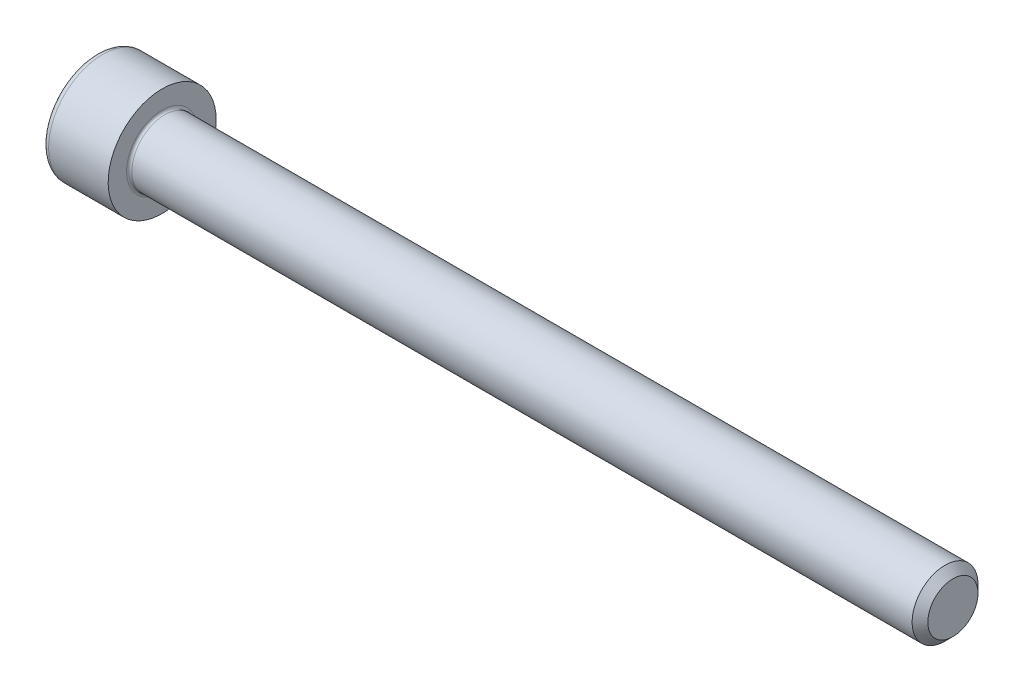
ISO-10303-21;
HEADER;
FILE_DESCRIPTION(('STEP AP214'),'2;1');
FILE_NAME('part.step','',(''),(''),'','','');
FILE_SCHEMA(('AUTOMOTIVE_DESIGN { 1 0 10303 214 1 1 1 1 }'));
ENDSEC;
DATA;
#1=APPLICATION_CONTEXT('core data for automotive mechanical design processes');
#2=APPLICATION_PROTOCOL_DEFINITION('international standard','automotive_design',2000,#1);
#3=PRODUCT_CONTEXT('',#1,'mechanical');
#4=PRODUCT('Part','Part','',(#3));
#5=PRODUCT_RELATED_PRODUCT_CATEGORY('part','',(#4));
#6=PRODUCT_DEFINITION_FORMATION('','',#4);
#7=PRODUCT_DEFINITION_CONTEXT('part definition',#1,'design');
#8=PRODUCT_DEFINITION('design','',#6,#7);
#9=PRODUCT_DEFINITION_SHAPE('','',#8);
#10=(LENGTH_UNIT() NAMED_UNIT(*) SI_UNIT(.MILLI.,.METRE.));
#11=(NAMED_UNIT(*) PLANE_ANGLE_UNIT() SI_UNIT($,.RADIAN.));
#12=(NAMED_UNIT(*) SI_UNIT($,.STERADIAN.) SOLID_ANGLE_UNIT());
#13=UNCERTAINTY_MEASURE_WITH_UNIT(LENGTH_MEASURE(1.E-05),#10,'distance_accuracy_value','');
#14=(GEOMETRIC_REPRESENTATION_CONTEXT(3) GLOBAL_UNCERTAINTY_ASSIGNED_CONTEXT((#13)) GLOBAL_UNIT_ASSIGNED_CONTEXT((#10,
#11,#12)) REPRESENTATION_CONTEXT('',''));
#15=CARTESIAN_POINT('',(0.,0.,0.));
#16=DIRECTION('',(0.,0.,1.));
#17=DIRECTION('',(1.,0.,0.));
#18=AXIS2_PLACEMENT_3D('',#15,#16,#17);
#19=CARTESIAN_POINT('',(-1.73197520001622,0.,0.));
#20=DIRECTION('',(-1.,0.,0.));
#21=DIRECTION('',(0.,0.,1.));
#22=AXIS2_PLACEMENT_3D('',#19,#20,#21);
#23=CONICAL_SURFACE('',#22,1.38675239173836,1.04719755120409);
#24=CARTESIAN_POINT('',(-0.93133333342621,1.13686837721616E-10,0.));
#25=VERTEX_POINT('',#24);
#26=VERTEX_LOOP('',#25);
#27=FACE_BOUND('',#26,.T.);
#28=CARTESIAN_POINT('',(-1.72720000001244,1.1938,0.689240751354982));
#29=CARTESIAN_POINT('',(-1.70970817089895,1.1938,0.628664837695865));
#30=CARTESIAN_POINT('',(-1.69380026777436,1.1938,0.567566033611831));
#31=CARTESIAN_POINT('',(-1.66603350065317,1.1938,0.444310540521224));
#32=CARTESIAN_POINT('',(-1.65418445841408,1.1938,0.382151662215969));
#33=CARTESIAN_POINT('',(-1.6357405699097,1.1938,0.258604209424688));
#34=CARTESIAN_POINT('',(-1.62902295503157,1.1938,0.197234638972875));
#35=CARTESIAN_POINT('',(-1.62100502447231,1.1938,0.074206884617875));
#36=CARTESIAN_POINT('',(-1.61969806765852,1.1938,0.0125491475802938));
#37=CARTESIAN_POINT('',(-1.62242392860873,1.1938,-0.102651719591601));
#38=CARTESIAN_POINT('',(-1.62578745716085,1.1938,-0.15621213655455));
#39=CARTESIAN_POINT('',(-1.63644571281367,1.1938,-0.262984041835023));
#40=CARTESIAN_POINT('',(-1.64374407719022,1.1938,-0.316195161132675));
#41=CARTESIAN_POINT('',(-1.66198857553395,1.1938,-0.423187026607383));
#42=CARTESIAN_POINT('',(-1.67301201065409,1.1938,-0.476954238351073));
#43=CARTESIAN_POINT('',(-1.69803054805828,1.1938,-0.583686955815079));
#44=CARTESIAN_POINT('',(-1.71201977575506,1.1938,-0.636653827850075));
#45=CARTESIAN_POINT('',(-1.72720000001244,1.1938,-0.689240751354984));
#46=B_SPLINE_CURVE_WITH_KNOTS('',3,(#28,#29,#30,#31,#32,#33,#34,#35,#36,#37,#38,#39,#40,#41,#42,
#43,#44,#45),.UNSPECIFIED.,.F.,.F.,(4,2,2,2,2,2,2,2,4),(0.,0.189226857297496,0.378908429381874,
0.563895970110463,0.748656386580298,0.90950117544892,1.07049490127057,1.23505869645672,
1.39929952238289),.UNSPECIFIED.);
#47=CARTESIAN_POINT('',(-1.72720000001244,1.19379999999845,0.689240751357676));
#48=VERTEX_POINT('',#47);
#49=CARTESIAN_POINT('',(-1.72720000001296,1.1938,-0.689240751356779));
#50=VERTEX_POINT('',#49);
#51=EDGE_CURVE('E21',#48,#50,#46,.T.);
#52=ORIENTED_EDGE('',*,*,#51,.T.);
#53=CARTESIAN_POINT('',(-1.72720000001244,1.19379999999689,-0.689240751360371));
#54=CARTESIAN_POINT('',(-1.70970817089895,1.14133971991064,-0.719528708189929));
#55=CARTESIAN_POINT('',(-1.69380026777436,1.08842660343302,-0.750078110231946));
#56=CARTESIAN_POINT('',(-1.66603350065317,0.981684215260574,-0.811705856777249));
#57=CARTESIAN_POINT('',(-1.65418445841408,0.927853047577479,-0.842785295929877));
#58=CARTESIAN_POINT('',(-1.6357405699097,0.820857814887371,-0.904559022325517));
#59=CARTESIAN_POINT('',(-1.62902295503157,0.767710207856762,-0.935243807551424));
#60=CARTESIAN_POINT('',(-1.62100502447231,0.66116504721478,-0.996757684728924));
#61=CARTESIAN_POINT('',(-1.61969806765852,0.607767880600374,-1.02758655324771));
#62=CARTESIAN_POINT('',(-1.62242392860872,0.508001003091517,-1.08518698683366));
#63=CARTESIAN_POINT('',(-1.62578745716085,0.461616321364316,-1.11196719531514));
#64=CARTESIAN_POINT('',(-1.63644571281367,0.36914913898096,-1.16535314795537));
#65=CARTESIAN_POINT('',(-1.64374407719022,0.323066957905389,-1.1919587076042));
#66=CARTESIAN_POINT('',(-1.66198857553395,0.230409284406005,-1.24545464034155));
#67=CARTESIAN_POINT('',(-1.67301201065409,0.183845513145312,-1.2723382462134));
#68=CARTESIAN_POINT('',(-1.69803054805828,0.0914122684065358,-1.3257046049454));
#69=CARTESIAN_POINT('',(-1.71201977575506,0.0455416116652293,-1.3521880409629));
#70=CARTESIAN_POINT('',(-1.72720000001244,3.1093190957536E-12,-1.37848150271535));
#71=B_SPLINE_CURVE_WITH_KNOTS('',3,(#53,#54,#55,#56,#57,#58,#59,#60,#61,#62,#63,#64,#65,#66,#67,
#68,#69,#70),.UNSPECIFIED.,.F.,.F.,(4,2,2,2,2,2,2,2,4),(0.,0.189226857297496,0.378908429381874,
0.563895970110463,0.748656386580297,0.90950117544892,1.07049490127057,1.23505869645672,
1.39929952238289),.UNSPECIFIED.);
#72=CARTESIAN_POINT('',(-1.72720000001244,0.,-1.37848150271535));
#73=VERTEX_POINT('',#72);
#74=EDGE_CURVE('E81',#50,#73,#71,.T.);
#75=ORIENTED_EDGE('',*,*,#74,.T.);
#76=CARTESIAN_POINT('',(-1.72720000001244,-3.11102390153181E-12,-1.37848150271535));
#77=CARTESIAN_POINT('',(-1.70970817089895,-0.0524602800893588,-1.3481935458858));
#78=CARTESIAN_POINT('',(-1.69380026777436,-0.105373396566981,-1.31764414384378));
#79=CARTESIAN_POINT('',(-1.66603350065317,-0.212115784739424,-1.25601639729847));
#80=CARTESIAN_POINT('',(-1.65418445841408,-0.26594695242252,-1.22493695814585));
#81=CARTESIAN_POINT('',(-1.6357405699097,-0.372942185112628,-1.16316323175021));
#82=CARTESIAN_POINT('',(-1.62902295503157,-0.426089792143237,-1.1324784465243));
#83=CARTESIAN_POINT('',(-1.62100502447231,-0.532634952785219,-1.0709645693468));
#84=CARTESIAN_POINT('',(-1.61969806765852,-0.586032119399625,-1.04013570082801));
#85=CARTESIAN_POINT('',(-1.62242392860873,-0.685798996908482,-0.982535267242062));
#86=CARTESIAN_POINT('',(-1.62578745716085,-0.732183678635683,-0.955755058760588));
#87=CARTESIAN_POINT('',(-1.63644571281367,-0.824650861019039,-0.902369106120351));
#88=CARTESIAN_POINT('',(-1.64374407719022,-0.87073304209461,-0.875763546471525));
#89=CARTESIAN_POINT('',(-1.66198857553395,-0.963390715593994,-0.822267613734171));
#90=CARTESIAN_POINT('',(-1.67301201065409,-1.00995448685469,-0.795384007862326));
#91=CARTESIAN_POINT('',(-1.69803054805828,-1.10238773159346,-0.742017649130323));
#92=CARTESIAN_POINT('',(-1.71201977575506,-1.14825838833477,-0.715534213112825));
#93=CARTESIAN_POINT('',(-1.72720000001244,-1.19379999999689,-0.68924075136037));
#94=B_SPLINE_CURVE_WITH_KNOTS('',3,(#76,#77,#78,#79,#80,#81,#82,#83,#84,#85,#86,#87,#88,#89,#90,
#91,#92,#93),.UNSPECIFIED.,.F.,.F.,(4,2,2,2,2,2,2,2,4),(0.,0.189226857297497,0.378908429381874,
0.563895970110463,0.748656386580298,0.90950117544892,1.07049490127057,1.23505869645672,
1.39929952238289),.UNSPECIFIED.);
#95=CARTESIAN_POINT('',(-1.72720000001244,-1.19379999999844,-0.689240751357677));
#96=VERTEX_POINT('',#95);
#97=EDGE_CURVE('E106',#73,#96,#94,.T.);
#98=ORIENTED_EDGE('',*,*,#97,.T.);
#99=CARTESIAN_POINT('',(-1.72720000001244,-1.1938,-0.689240751354983));
#100=CARTESIAN_POINT('',(-1.70970817089895,-1.1938,-0.628664837695867));
#101=CARTESIAN_POINT('',(-1.69380026777436,-1.1938,-0.567566033611832));
#102=CARTESIAN_POINT('',(-1.66603350065317,-1.1938,-0.444310540521225));
#103=CARTESIAN_POINT('',(-1.65418445841408,-1.1938,-0.38215166221597));
#104=CARTESIAN_POINT('',(-1.6357405699097,-1.1938,-0.258604209424689));
#105=CARTESIAN_POINT('',(-1.62902295503157,-1.1938,-0.197234638972876));
#106=CARTESIAN_POINT('',(-1.62100502447231,-1.1938,-0.074206884617876));
#107=CARTESIAN_POINT('',(-1.61969806765852,-1.1938,-0.0125491475802948));
#108=CARTESIAN_POINT('',(-1.62242392860873,-1.1938,0.1026517195916));
#109=CARTESIAN_POINT('',(-1.62578745716085,-1.1938,0.156212136554549));
#110=CARTESIAN_POINT('',(-1.63644571281367,-1.1938,0.262984041835022));
#111=CARTESIAN_POINT('',(-1.64374407719022,-1.1938,0.316195161132674));
#112=CARTESIAN_POINT('',(-1.66198857553395,-1.1938,0.423187026607382));
#113=CARTESIAN_POINT('',(-1.67301201065409,-1.1938,0.476954238351073));
#114=CARTESIAN_POINT('',(-1.69803054805828,-1.1938,0.583686955815078));
#115=CARTESIAN_POINT('',(-1.71201977575506,-1.1938,0.636653827850075));
#116=CARTESIAN_POINT('',(-1.72720000001244,-1.1938,0.689240751354983));
#117=B_SPLINE_CURVE_WITH_KNOTS('',3,(#99,#100,#101,#102,#103,#104,#105,#106,#107,#108,#109,#110,
#111,#112,#113,#114,#115,#116),.UNSPECIFIED.,.F.,.F.,(4,2,2,2,2,2,2,2,4),(0.,0.189226857297497,
0.378908429381875,0.563895970110464,0.748656386580298,0.909501175448921,1.07049490127057,
1.23505869645672,1.39929952238289),.UNSPECIFIED.);
#118=CARTESIAN_POINT('',(-1.72720000001244,-1.19379999999844,0.689240751357677));
#119=VERTEX_POINT('',#118);
#120=EDGE_CURVE('E130',#96,#119,#117,.T.);
#121=ORIENTED_EDGE('',*,*,#120,.T.);
#122=CARTESIAN_POINT('',(-1.72720000001244,-1.19379999999689,0.68924075136037));
#123=CARTESIAN_POINT('',(-1.70970817089895,-1.14133971991064,0.719528708189929));
#124=CARTESIAN_POINT('',(-1.69380026777436,-1.08842660343302,0.750078110231946));
#125=CARTESIAN_POINT('',(-1.66603350065317,-0.981684215260577,0.81170585677725));
#126=CARTESIAN_POINT('',(-1.65418445841408,-0.927853047577481,0.842785295929877));
#127=CARTESIAN_POINT('',(-1.6357405699097,-0.820857814887373,0.904559022325517));
#128=CARTESIAN_POINT('',(-1.62902295503157,-0.767710207856764,0.935243807551424));
#129=CARTESIAN_POINT('',(-1.62100502447231,-0.661165047214782,0.996757684728924));
#130=CARTESIAN_POINT('',(-1.61969806765852,-0.607767880600376,1.02758655324771));
#131=CARTESIAN_POINT('',(-1.62242392860873,-0.508001003091518,1.08518698683366));
#132=CARTESIAN_POINT('',(-1.62578745716085,-0.461616321364317,1.11196719531514));
#133=CARTESIAN_POINT('',(-1.63644571281367,-0.369149138980961,1.16535314795537));
#134=CARTESIAN_POINT('',(-1.64374407719022,-0.32306695790539,1.1919587076042));
#135=CARTESIAN_POINT('',(-1.66198857553395,-0.230409284406006,1.24545464034155));
#136=CARTESIAN_POINT('',(-1.67301201065409,-0.183845513145313,1.2723382462134));
#137=CARTESIAN_POINT('',(-1.69803054805828,-0.0914122684065366,1.3257046049454));
#138=CARTESIAN_POINT('',(-1.71201977575506,-0.0455416116652301,1.3521880409629));
#139=CARTESIAN_POINT('',(-1.72720000001244,-3.11015438542773E-12,1.37848150271535));
#140=B_SPLINE_CURVE_WITH_KNOTS('',3,(#122,#123,#124,#125,#126,#127,#128,#129,#130,#131,#132,
#133,#134,#135,#136,#137,#138,#139),.UNSPECIFIED.,.F.,.F.,(4,2,2,2,2,2,2,2,4),(0.,
0.189226857297497,0.378908429381875,0.563895970110464,0.748656386580298,0.909501175448921,
1.07049490127057,1.23505869645672,1.3992995223829),.UNSPECIFIED.);
#141=CARTESIAN_POINT('',(-1.72720000001244,0.,1.37848150271535));
#142=VERTEX_POINT('',#141);
#143=EDGE_CURVE('E138',#119,#142,#140,.T.);
#144=ORIENTED_EDGE('',*,*,#143,.T.);
#145=CARTESIAN_POINT('',(-1.72720000001244,3.11022577188329E-12,1.37848150271535));
#146=CARTESIAN_POINT('',(-1.70970817089895,0.052460280089358,1.3481935458858));
#147=CARTESIAN_POINT('',(-1.69380026777436,0.105373396566981,1.31764414384378));
#148=CARTESIAN_POINT('',(-1.66603350065317,0.212115784739423,1.25601639729848));
#149=CARTESIAN_POINT('',(-1.65418445841408,0.265946952422519,1.22493695814585));
#150=CARTESIAN_POINT('',(-1.6357405699097,0.372942185112627,1.16316323175021));
#151=CARTESIAN_POINT('',(-1.62902295503157,0.426089792143236,1.1324784465243));
#152=CARTESIAN_POINT('',(-1.62100502447231,0.532634952785218,1.0709645693468));
#153=CARTESIAN_POINT('',(-1.61969806765852,0.586032119399624,1.04013570082801));
#154=CARTESIAN_POINT('',(-1.62242392860873,0.685798996908482,0.982535267242062));
#155=CARTESIAN_POINT('',(-1.62578745716085,0.732183678635683,0.955755058760588));
#156=CARTESIAN_POINT('',(-1.63644571281367,0.824650861019039,0.902369106120351));
#157=CARTESIAN_POINT('',(-1.64374407719022,0.870733042094609,0.875763546471525));
#158=CARTESIAN_POINT('',(-1.66198857553395,0.963390715593994,0.822267613734171));
#159=CARTESIAN_POINT('',(-1.67301201065409,1.00995448685469,0.795384007862325));
#160=CARTESIAN_POINT('',(-1.69803054805828,1.10238773159346,0.742017649130322));
#161=CARTESIAN_POINT('',(-1.71201977575506,1.14825838833477,0.715534213112824));
#162=CARTESIAN_POINT('',(-1.72720000001244,1.19379999999689,0.68924075136037));
#163=B_SPLINE_CURVE_WITH_KNOTS('',3,(#145,#146,#147,#148,#149,#150,#151,#152,#153,#154,#155,
#156,#157,#158,#159,#160,#161,#162),.UNSPECIFIED.,.F.,.F.,(4,2,2,2,2,2,2,2,4),(0.,
0.189226857297497,0.378908429381875,0.563895970110464,0.748656386580298,0.909501175448921,
1.07049490127057,1.23505869645673,1.3992995223829),.UNSPECIFIED.);
#164=EDGE_CURVE('E83',#142,#48,#163,.T.);
#165=ORIENTED_EDGE('',*,*,#164,.T.);
#166=EDGE_LOOP('',(#52,#75,#98,#121,#144,#165));
#167=FACE_BOUND('',#166,.T.);
#168=ADVANCED_FACE('F17',(#27,#167),#23,.F.);
#169=CARTESIAN_POINT('',(-3.175,1.1938,0.689240751358572));
#170=DIRECTION('',(0.,1.,0.));
#171=DIRECTION('',(0.,0.,1.));
#172=AXIS2_PLACEMENT_3D('',#169,#170,#171);
#173=PLANE('',#172);
#174=DIRECTION('',(1.,0.,0.));
#175=VECTOR('',#174,1.);
#176=CARTESIAN_POINT('',(-3.175,1.1938,0.689240751358574));
#177=LINE('',#176,#175);
#178=CARTESIAN_POINT('',(-3.175,1.1938,0.689240751358573));
#179=VERTEX_POINT('',#178);
#180=EDGE_CURVE('E85',#48,#179,#177,.F.);
#181=ORIENTED_EDGE('',*,*,#180,.T.);
#182=DIRECTION('',(0.,0.,1.));
#183=VECTOR('',#182,1.);
#184=CARTESIAN_POINT('',(-3.175,1.1938,0.));
#185=LINE('',#184,#183);
#186=CARTESIAN_POINT('',(-3.175,1.1938,-0.689240751358575));
#187=VERTEX_POINT('',#186);
#188=EDGE_CURVE('E90',#187,#179,#185,.T.);
#189=ORIENTED_EDGE('',*,*,#188,.F.);
#190=DIRECTION('',(1.,0.,0.));
#191=VECTOR('',#190,1.);
#192=CARTESIAN_POINT('',(-3.175,1.1938,-0.689240751358575));
#193=LINE('',#192,#191);
#194=EDGE_CURVE('E88',#187,#50,#193,.T.);
#195=ORIENTED_EDGE('',*,*,#194,.T.);
#196=ORIENTED_EDGE('',*,*,#51,.F.);
#197=EDGE_LOOP('',(#181,#189,#195,#196));
#198=FACE_BOUND('',#197,.T.);
#199=ADVANCED_FACE('F77',(#198),#173,.F.);
#200=CARTESIAN_POINT('',(-3.175,0.,1.37848150271715));
#201=DIRECTION('',(0.,0.5,0.866025403784438));
#202=DIRECTION('',(0.,-0.866025403784438,0.5));
#203=AXIS2_PLACEMENT_3D('',#200,#201,#202);
#204=PLANE('',#203);
#205=DIRECTION('',(1.,0.,0.));
#206=VECTOR('',#205,1.);
#207=CARTESIAN_POINT('',(-3.175,0.,1.37848150271715));
#208=LINE('',#207,#206);
#209=CARTESIAN_POINT('',(-3.175,0.,1.37848150271715));
#210=VERTEX_POINT('',#209);
#211=EDGE_CURVE('E142',#142,#210,#208,.F.);
#212=ORIENTED_EDGE('',*,*,#211,.T.);
#213=DIRECTION('',(0.,-0.866025403784438,0.500000000000001));
#214=VECTOR('',#213,1.);
#215=CARTESIAN_POINT('',(-3.175,1.1938,0.689240751358572));
#216=LINE('',#215,#214);
#217=EDGE_CURVE('E96',#179,#210,#216,.T.);
#218=ORIENTED_EDGE('',*,*,#217,.F.);
#219=ORIENTED_EDGE('',*,*,#180,.F.);
#220=ORIENTED_EDGE('',*,*,#164,.F.);
#221=EDGE_LOOP('',(#212,#218,#219,#220));
#222=FACE_BOUND('',#221,.T.);
#223=ADVANCED_FACE('F146',(#222),#204,.F.);
#224=CARTESIAN_POINT('',(-3.175,-1.1938,0.689240751358575));
#225=DIRECTION('',(0.,-0.5,0.866025403784439));
#226=DIRECTION('',(0.,-0.866025403784439,-0.5));
#227=AXIS2_PLACEMENT_3D('',#224,#225,#226);
#228=PLANE('',#227);
#229=DIRECTION('',(1.,0.,0.));
#230=VECTOR('',#229,1.);
#231=CARTESIAN_POINT('',(-3.175,-1.1938,0.689240751358575));
#232=LINE('',#231,#230);
#233=CARTESIAN_POINT('',(-3.175,-1.1938,0.689240751358575));
#234=VERTEX_POINT('',#233);
#235=EDGE_CURVE('E137',#119,#234,#232,.F.);
#236=ORIENTED_EDGE('',*,*,#235,.T.);
#237=DIRECTION('',(0.,-0.866025403784439,-0.5));
#238=VECTOR('',#237,1.);
#239=CARTESIAN_POINT('',(-3.175,0.,1.37848150271715));
#240=LINE('',#239,#238);
#241=EDGE_CURVE('E265',#210,#234,#240,.T.);
#242=ORIENTED_EDGE('',*,*,#241,.F.);
#243=ORIENTED_EDGE('',*,*,#211,.F.);
#244=ORIENTED_EDGE('',*,*,#143,.F.);
#245=EDGE_LOOP('',(#236,#242,#243,#244));
#246=FACE_BOUND('',#245,.T.);
#247=ADVANCED_FACE('F126',(#246),#228,.F.);
#248=CARTESIAN_POINT('',(-3.175,-1.1938,-0.689240751358575));
#249=DIRECTION('',(0.,-1.,0.));
#250=DIRECTION('',(1.,0.,0.));
#251=AXIS2_PLACEMENT_3D('',#248,#249,#250);
#252=PLANE('',#251);
#253=DIRECTION('',(1.,0.,0.));
#254=VECTOR('',#253,1.);
#255=CARTESIAN_POINT('',(-3.175,-1.1938,-0.689240751358575));
#256=LINE('',#255,#254);
#257=CARTESIAN_POINT('',(-3.175,-1.1938,-0.689240751358575));
#258=VERTEX_POINT('',#257);
#259=EDGE_CURVE('E136',#96,#258,#256,.F.);
#260=ORIENTED_EDGE('',*,*,#259,.T.);
#261=DIRECTION('',(0.,0.,1.));
#262=VECTOR('',#261,1.);
#263=CARTESIAN_POINT('',(-3.175,-1.1938,0.));
#264=LINE('',#263,#262);
#265=EDGE_CURVE('E260',#234,#258,#264,.F.);
#266=ORIENTED_EDGE('',*,*,#265,.F.);
#267=ORIENTED_EDGE('',*,*,#235,.F.);
#268=ORIENTED_EDGE('',*,*,#120,.F.);
#269=EDGE_LOOP('',(#260,#266,#267,#268));
#270=FACE_BOUND('',#269,.T.);
#271=ADVANCED_FACE('F122',(#270),#252,.F.);
#272=CARTESIAN_POINT('',(-3.175,0.,-1.37848150271715));
#273=DIRECTION('',(0.,-0.5,-0.866025403784438));
#274=DIRECTION('',(0.,0.866025403784438,-0.5));
#275=AXIS2_PLACEMENT_3D('',#272,#273,#274);
#276=PLANE('',#275);
#277=DIRECTION('',(1.,0.,0.));
#278=VECTOR('',#277,1.);
#279=CARTESIAN_POINT('',(-3.175,0.,-1.37848150271715));
#280=LINE('',#279,#278);
#281=CARTESIAN_POINT('',(-3.175,0.,-1.37848150271715));
#282=VERTEX_POINT('',#281);
#283=EDGE_CURVE('E39',#73,#282,#280,.F.);
#284=ORIENTED_EDGE('',*,*,#283,.T.);
#285=DIRECTION('',(0.,0.866025403784439,-0.5));
#286=VECTOR('',#285,1.);
#287=CARTESIAN_POINT('',(-3.175,-1.1938,-0.689240751358575));
#288=LINE('',#287,#286);
#289=EDGE_CURVE('E255',#258,#282,#288,.T.);
#290=ORIENTED_EDGE('',*,*,#289,.F.);
#291=ORIENTED_EDGE('',*,*,#259,.F.);
#292=ORIENTED_EDGE('',*,*,#97,.F.);
#293=EDGE_LOOP('',(#284,#290,#291,#292));
#294=FACE_BOUND('',#293,.T.);
#295=ADVANCED_FACE('F116',(#294),#276,.F.);
#296=CARTESIAN_POINT('',(-3.175,1.1938,-0.689240751358575));
#297=DIRECTION('',(0.,0.5,-0.866025403784439));
#298=DIRECTION('',(0.,0.866025403784439,0.5));
#299=AXIS2_PLACEMENT_3D('',#296,#297,#298);
#300=PLANE('',#299);
#301=ORIENTED_EDGE('',*,*,#194,.F.);
#302=DIRECTION('',(0.,0.866025403784438,0.500000000000001));
#303=VECTOR('',#302,1.);
#304=CARTESIAN_POINT('',(-3.175,0.,-1.37848150271715));
#305=LINE('',#304,#303);
#306=EDGE_CURVE('E253',#282,#187,#305,.T.);
#307=ORIENTED_EDGE('',*,*,#306,.F.);
#308=ORIENTED_EDGE('',*,*,#283,.F.);
#309=ORIENTED_EDGE('',*,*,#74,.F.);
#310=EDGE_LOOP('',(#301,#307,#308,#309));
#311=FACE_BOUND('',#310,.T.);
#312=ADVANCED_FACE('F94',(#311),#300,.F.);
#313=CARTESIAN_POINT('',(-3.175,1.99099075135857,0.));
#314=DIRECTION('',(-1.,0.,0.));
#315=DIRECTION('',(0.,-1.,0.));
#316=AXIS2_PLACEMENT_3D('',#313,#314,#315);
#317=PLANE('',#316);
#318=ORIENTED_EDGE('',*,*,#289,.T.);
#319=ORIENTED_EDGE('',*,*,#306,.T.);
#320=ORIENTED_EDGE('',*,*,#188,.T.);
#321=ORIENTED_EDGE('',*,*,#217,.T.);
#322=ORIENTED_EDGE('',*,*,#241,.T.);
#323=ORIENTED_EDGE('',*,*,#265,.T.);
#324=EDGE_LOOP('',(#318,#319,#320,#321,#322,#323));
#325=FACE_BOUND('',#324,.T.);
#326=CARTESIAN_POINT('',(-3.175,0.,0.));
#327=DIRECTION('',(1.,0.,0.));
#328=DIRECTION('',(0.,1.,0.));
#329=AXIS2_PLACEMENT_3D('',#326,#327,#328);
#330=CIRCLE('',#329,2.2987);
#331=CARTESIAN_POINT('',(-3.175,2.2987,0.));
#332=VERTEX_POINT('',#331);
#333=EDGE_CURVE('E216',#332,#332,#330,.T.);
#334=ORIENTED_EDGE('',*,*,#333,.F.);
#335=EDGE_LOOP('',(#334));
#336=FACE_BOUND('',#335,.T.);
#337=ADVANCED_FACE('F115',(#325,#336),#317,.T.);
#338=CARTESIAN_POINT('',(-2.8702,0.,0.));
#339=DIRECTION('',(1.,0.,0.));
#340=DIRECTION('',(0.,0.,-1.));
#341=AXIS2_PLACEMENT_3D('',#338,#339,#340);
#342=TOROIDAL_SURFACE('',#341,2.2987,0.3048);
#343=CARTESIAN_POINT('',(-2.8702,0.,0.));
#344=DIRECTION('',(1.,0.,0.));
#345=DIRECTION('',(0.,1.,0.));
#346=AXIS2_PLACEMENT_3D('',#343,#344,#345);
#347=CIRCLE('',#346,2.6035);
#348=CARTESIAN_POINT('',(-2.8702,2.6035,0.));
#349=VERTEX_POINT('',#348);
#350=EDGE_CURVE('E280',#349,#349,#347,.T.);
#351=ORIENTED_EDGE('',*,*,#350,.F.);
#352=EDGE_LOOP('',(#351));
#353=FACE_BOUND('',#352,.T.);
#354=ORIENTED_EDGE('',*,*,#333,.T.);
#355=EDGE_LOOP('',(#354));
#356=FACE_BOUND('',#355,.T.);
#357=ADVANCED_FACE('F200',(#353,#356),#342,.T.);
#358=CARTESIAN_POINT('',(-1.58749999999999,0.,0.));
#359=DIRECTION('',(1.,0.,0.));
#360=DIRECTION('',(0.,1.,0.));
#361=AXIS2_PLACEMENT_3D('',#358,#359,#360);
#362=CYLINDRICAL_SURFACE('',#361,2.6035);
#363=ORIENTED_EDGE('',*,*,#350,.T.);
#364=EDGE_LOOP('',(#363));
#365=FACE_BOUND('',#364,.T.);
#366=CARTESIAN_POINT('',(0.,0.,0.));
#367=DIRECTION('',(1.,0.,0.));
#368=DIRECTION('',(0.,1.,0.));
#369=AXIS2_PLACEMENT_3D('',#366,#367,#368);
#370=CIRCLE('',#369,2.6035);
#371=CARTESIAN_POINT('',(0.,2.6035,0.));
#372=VERTEX_POINT('',#371);
#373=EDGE_CURVE('E104',#372,#372,#370,.T.);
#374=ORIENTED_EDGE('',*,*,#373,.F.);
#375=EDGE_LOOP('',(#374));
#376=FACE_BOUND('',#375,.T.);
#377=ADVANCED_FACE('F197',(#365,#376),#362,.T.);
#378=CARTESIAN_POINT('',(38.1,0.79375,0.));
#379=DIRECTION('',(1.,0.,0.));
#380=DIRECTION('',(0.,1.,0.));
#381=AXIS2_PLACEMENT_3D('',#378,#379,#380);
#382=PLANE('',#381);
#383=CARTESIAN_POINT('',(38.0999999999858,0.,0.));
#384=DIRECTION('',(-1.,0.,0.));
#385=DIRECTION('',(0.,0.,1.));
#386=AXIS2_PLACEMENT_3D('',#383,#384,#385);
#387=CIRCLE('',#386,1.209039999992);
#388=CARTESIAN_POINT('',(38.0999999999858,0.,1.209039999992));
#389=VERTEX_POINT('',#388);
#390=EDGE_CURVE('E275',#389,#389,#387,.T.);
#391=ORIENTED_EDGE('',*,*,#390,.F.);
#392=EDGE_LOOP('',(#391));
#393=FACE_BOUND('',#392,.T.);
#394=ADVANCED_FACE('F194',(#393),#382,.T.);
#395=CARTESIAN_POINT('',(0.,2.0955,0.));
#396=DIRECTION('',(1.,0.,0.));
#397=DIRECTION('',(0.,1.,0.));
#398=AXIS2_PLACEMENT_3D('',#395,#396,#397);
#399=PLANE('',#398);
#400=CARTESIAN_POINT('',(0.,0.,0.));
#401=DIRECTION('',(1.,0.,0.));
#402=DIRECTION('',(0.,1.,0.));
#403=AXIS2_PLACEMENT_3D('',#400,#401,#402);
#404=CIRCLE('',#403,1.7145);
#405=CARTESIAN_POINT('',(0.,1.7145,0.));
#406=VERTEX_POINT('',#405);
#407=EDGE_CURVE('E181',#406,#406,#404,.F.);
#408=ORIENTED_EDGE('',*,*,#407,.T.);
#409=EDGE_LOOP('',(#408));
#410=FACE_BOUND('',#409,.T.);
#411=ORIENTED_EDGE('',*,*,#373,.T.);
#412=EDGE_LOOP('',(#411));
#413=FACE_BOUND('',#412,.T.);
#414=ADVANCED_FACE('F185',(#410,#413),#399,.T.);
#415=CARTESIAN_POINT('',(37.7215400001205,0.,0.));
#416=DIRECTION('',(-1.,0.,0.));
#417=DIRECTION('',(0.,0.,1.));
#418=AXIS2_PLACEMENT_3D('',#415,#416,#417);
#419=CONICAL_SURFACE('',#418,1.58749999991414,0.785398163472547);
#420=ORIENTED_EDGE('',*,*,#390,.T.);
#421=EDGE_LOOP('',(#420));
#422=FACE_BOUND('',#421,.T.);
#423=CARTESIAN_POINT('',(37.72154,0.,0.));
#424=DIRECTION('',(1.,0.,0.));
#425=DIRECTION('',(0.,1.,0.));
#426=AXIS2_PLACEMENT_3D('',#423,#424,#425);
#427=CIRCLE('',#426,1.5875);
#428=CARTESIAN_POINT('',(37.72154,1.5875,0.));
#429=VERTEX_POINT('',#428);
#430=EDGE_CURVE('E30',#429,#429,#427,.F.);
#431=ORIENTED_EDGE('',*,*,#430,.F.);
#432=EDGE_LOOP('',(#431));
#433=FACE_BOUND('',#432,.T.);
#434=ADVANCED_FACE('F163',(#422,#433),#419,.T.);
#435=CARTESIAN_POINT('',(0.127000000000002,0.,0.));
#436=DIRECTION('',(1.,0.,0.));
#437=DIRECTION('',(0.,0.,-1.));
#438=AXIS2_PLACEMENT_3D('',#435,#436,#437);
#439=TOROIDAL_SURFACE('',#438,1.7145,0.127);
#440=CARTESIAN_POINT('',(0.127000000000002,0.,0.));
#441=DIRECTION('',(1.,0.,0.));
#442=DIRECTION('',(0.,1.,0.));
#443=AXIS2_PLACEMENT_3D('',#440,#441,#442);
#444=CIRCLE('',#443,1.5875);
#445=CARTESIAN_POINT('',(0.127000000000002,1.5875,0.));
#446=VERTEX_POINT('',#445);
#447=EDGE_CURVE('E11',#446,#446,#444,.T.);
#448=ORIENTED_EDGE('',*,*,#447,.F.);
#449=EDGE_LOOP('',(#448));
#450=FACE_BOUND('',#449,.T.);
#451=ORIENTED_EDGE('',*,*,#407,.F.);
#452=EDGE_LOOP('',(#451));
#453=FACE_BOUND('',#452,.T.);
#454=ADVANCED_FACE('F157',(#450,#453),#439,.F.);
#455=CARTESIAN_POINT('',(28.575,0.,0.));
#456=DIRECTION('',(1.,0.,0.));
#457=DIRECTION('',(0.,1.,0.));
#458=AXIS2_PLACEMENT_3D('',#455,#456,#457);
#459=CYLINDRICAL_SURFACE('',#458,1.5875);
#460=ORIENTED_EDGE('',*,*,#447,.T.);
#461=EDGE_LOOP('',(#460));
#462=FACE_BOUND('',#461,.T.);
#463=ORIENTED_EDGE('',*,*,#430,.T.);
#464=EDGE_LOOP('',(#463));
#465=FACE_BOUND('',#464,.T.);
#466=ADVANCED_FACE('F155',(#462,#465),#459,.T.);
#467=CLOSED_SHELL('',(#168,#199,#223,#247,#271,#295,#312,#337,#357,#377,#394,#414,#434,#454,#466));
#468=MANIFOLD_SOLID_BREP('B1',#467);
#469=ADVANCED_BREP_SHAPE_REPRESENTATION('',(#18,#468),#14);
#470=SHAPE_DEFINITION_REPRESENTATION(#9,#469);
ENDSEC;
END-ISO-10303-21;
